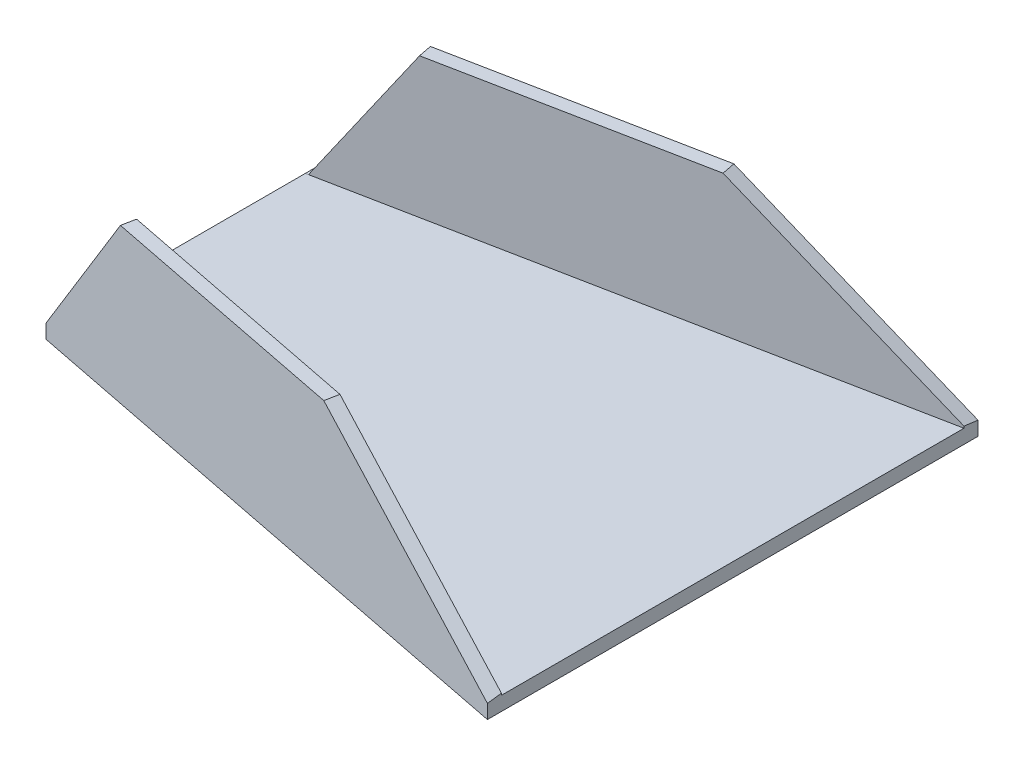
ISO-10303-21;
HEADER;
FILE_DESCRIPTION(('STEP AP214'),'2;1');
FILE_NAME('part.step','',(''),(''),'','','');
FILE_SCHEMA(('AUTOMOTIVE_DESIGN { 1 0 10303 214 1 1 1 1 }'));
ENDSEC;
DATA;
#1=APPLICATION_CONTEXT('core data for automotive mechanical design processes');
#2=APPLICATION_PROTOCOL_DEFINITION('international standard','automotive_design',2000,#1);
#3=PRODUCT_CONTEXT('',#1,'mechanical');
#4=PRODUCT('Part','Part','',(#3));
#5=PRODUCT_RELATED_PRODUCT_CATEGORY('part','',(#4));
#6=PRODUCT_DEFINITION_FORMATION('','',#4);
#7=PRODUCT_DEFINITION_CONTEXT('part definition',#1,'design');
#8=PRODUCT_DEFINITION('design','',#6,#7);
#9=PRODUCT_DEFINITION_SHAPE('','',#8);
#10=(LENGTH_UNIT() NAMED_UNIT(*) SI_UNIT(.MILLI.,.METRE.));
#11=(NAMED_UNIT(*) PLANE_ANGLE_UNIT() SI_UNIT($,.RADIAN.));
#12=(NAMED_UNIT(*) SI_UNIT($,.STERADIAN.) SOLID_ANGLE_UNIT());
#13=UNCERTAINTY_MEASURE_WITH_UNIT(LENGTH_MEASURE(1.E-05),#10,'distance_accuracy_value','');
#14=(GEOMETRIC_REPRESENTATION_CONTEXT(3) GLOBAL_UNCERTAINTY_ASSIGNED_CONTEXT((#13)) GLOBAL_UNIT_ASSIGNED_CONTEXT((#10,
#11,#12)) REPRESENTATION_CONTEXT('',''));
#15=CARTESIAN_POINT('',(0.,0.,0.));
#16=DIRECTION('',(0.,0.,1.));
#17=DIRECTION('',(1.,0.,0.));
#18=AXIS2_PLACEMENT_3D('',#15,#16,#17);
#19=CARTESIAN_POINT('',(0.,2.,0.));
#20=DIRECTION('',(0.,1.,0.));
#21=DIRECTION('',(0.,0.,1.));
#22=AXIS2_PLACEMENT_3D('',#19,#20,#21);
#23=PLANE('',#22);
#24=DIRECTION('',(-0.19375,0.,0.98105093522202));
#25=VECTOR('',#24,1.);
#26=CARTESIAN_POINT('',(0.968750000000003,1.99999999999999,34.0947453238899));
#27=LINE('',#26,#25);
#28=CARTESIAN_POINT('',(0.38015723739853,1.99999999999999,37.075078125));
#29=VERTEX_POINT('',#28);
#30=CARTESIAN_POINT('',(0.,1.99999999999999,39.));
#31=VERTEX_POINT('',#30);
#32=EDGE_CURVE('E217',#29,#31,#27,.T.);
#33=ORIENTED_EDGE('',*,*,#32,.F.);
#34=DIRECTION('',(-0.98105093522202,0.,-0.19375));
#35=VECTOR('',#34,1.);
#36=CARTESIAN_POINT('',(78.4840748177616,2.,52.5));
#37=LINE('',#36,#35);
#38=CARTESIAN_POINT('',(78.4840748177616,2.,52.5));
#39=VERTEX_POINT('',#38);
#40=EDGE_CURVE('E156',#39,#29,#37,.T.);
#41=ORIENTED_EDGE('',*,*,#40,.F.);
#42=DIRECTION('',(0.,0.,-1.));
#43=VECTOR('',#42,1.);
#44=CARTESIAN_POINT('',(78.4840748177616,2.,54.5));
#45=LINE('',#44,#43);
#46=CARTESIAN_POINT('',(78.4840748177616,2.,-13.5));
#47=VERTEX_POINT('',#46);
#48=EDGE_CURVE('E141',#39,#47,#45,.T.);
#49=ORIENTED_EDGE('',*,*,#48,.T.);
#50=DIRECTION('',(0.98105093522202,0.,-0.19375));
#51=VECTOR('',#50,1.);
#52=CARTESIAN_POINT('',(78.4840748177616,2.,-13.5));
#53=LINE('',#52,#51);
#54=CARTESIAN_POINT('',(0.,2.,1.99999999999999));
#55=VERTEX_POINT('',#54);
#56=EDGE_CURVE('E208',#55,#47,#53,.T.);
#57=ORIENTED_EDGE('',*,*,#56,.F.);
#58=DIRECTION('',(0.,0.,1.));
#59=VECTOR('',#58,1.);
#60=CARTESIAN_POINT('',(0.,2.,0.));
#61=LINE('',#60,#59);
#62=EDGE_CURVE('E146',#55,#31,#61,.T.);
#63=ORIENTED_EDGE('',*,*,#62,.T.);
#64=EDGE_LOOP('',(#33,#41,#49,#57,#63));
#65=FACE_BOUND('',#64,.T.);
#66=ADVANCED_FACE('F33',(#65),#23,.T.);
#67=CARTESIAN_POINT('',(78.4840748177616,2.,-15.5));
#68=DIRECTION('',(0.19375,0.,0.98105093522202));
#69=DIRECTION('',(0.98105093522202,0.,-0.19375));
#70=AXIS2_PLACEMENT_3D('',#67,#68,#69);
#71=PLANE('',#70);
#72=DIRECTION('',(-0.98105093522202,0.,0.19375));
#73=VECTOR('',#72,1.);
#74=CARTESIAN_POINT('',(0.,22.,0.));
#75=LINE('',#74,#73);
#76=CARTESIAN_POINT('',(49.3947183240999,22.,-9.75507624701314));
#77=VERTEX_POINT('',#76);
#78=CARTESIAN_POINT('',(13.2343623993372,22.,-2.61368459354385));
#79=VERTEX_POINT('',#78);
#80=EDGE_CURVE('E134',#77,#79,#75,.T.);
#81=ORIENTED_EDGE('',*,*,#80,.F.);
#82=DIRECTION('',(-0.813328085889316,0.559192903470748,0.160626029682539));
#83=VECTOR('',#82,1.);
#84=CARTESIAN_POINT('',(78.4840748177616,1.99999999999999,-15.5));
#85=LINE('',#84,#83);
#86=CARTESIAN_POINT('',(78.4840748177616,1.99999999999999,-15.5));
#87=VERTEX_POINT('',#86);
#88=EDGE_CURVE('E48',#87,#77,#85,.T.);
#89=ORIENTED_EDGE('',*,*,#88,.F.);
#90=DIRECTION('',(0.,-1.,0.));
#91=VECTOR('',#90,1.);
#92=CARTESIAN_POINT('',(78.4840748177616,2.,-15.5));
#93=LINE('',#92,#91);
#94=CARTESIAN_POINT('',(78.4840748177616,0.,-15.5));
#95=VERTEX_POINT('',#94);
#96=EDGE_CURVE('E131',#87,#95,#93,.T.);
#97=ORIENTED_EDGE('',*,*,#96,.T.);
#98=DIRECTION('',(-0.98105093522202,0.,0.19375));
#99=VECTOR('',#98,1.);
#100=CARTESIAN_POINT('',(78.4840748177616,0.,-15.5));
#101=LINE('',#100,#99);
#102=CARTESIAN_POINT('',(0.,0.,0.));
#103=VERTEX_POINT('',#102);
#104=EDGE_CURVE('E163',#95,#103,#101,.T.);
#105=ORIENTED_EDGE('',*,*,#104,.T.);
#106=DIRECTION('',(0.,-1.,0.));
#107=VECTOR('',#106,1.);
#108=CARTESIAN_POINT('',(0.,2.,0.));
#109=LINE('',#108,#107);
#110=CARTESIAN_POINT('',(0.,2.00027477475535,0.));
#111=VERTEX_POINT('',#110);
#112=EDGE_CURVE('E152',#111,#103,#109,.T.);
#113=ORIENTED_EDGE('',*,*,#112,.F.);
#114=DIRECTION('',(-0.548596720919497,-0.829037572555039,0.108343625047458));
#115=VECTOR('',#114,1.);
#116=CARTESIAN_POINT('',(0.,2.00027477475535,0.));
#117=LINE('',#116,#115);
#118=EDGE_CURVE('E229',#79,#111,#117,.T.);
#119=ORIENTED_EDGE('',*,*,#118,.F.);
#120=EDGE_LOOP('',(#81,#89,#97,#105,#113,#119));
#121=FACE_BOUND('',#120,.T.);
#122=ADVANCED_FACE('F35',(#121),#71,.F.);
#123=CARTESIAN_POINT('',(0.,2.,0.));
#124=DIRECTION('',(1.,0.,0.));
#125=DIRECTION('',(0.,0.,-1.));
#126=AXIS2_PLACEMENT_3D('',#123,#124,#125);
#127=PLANE('',#126);
#128=DIRECTION('',(0.,-1.,0.));
#129=VECTOR('',#128,1.);
#130=CARTESIAN_POINT('',(0.,22.,1.99999999999999));
#131=LINE('',#130,#129);
#132=CARTESIAN_POINT('',(0.,2.00027477475535,1.99999999999999));
#133=VERTEX_POINT('',#132);
#134=EDGE_CURVE('E203',#133,#55,#131,.T.);
#135=ORIENTED_EDGE('',*,*,#134,.F.);
#136=DIRECTION('',(0.,0.,-1.));
#137=VECTOR('',#136,1.);
#138=CARTESIAN_POINT('',(0.,2.00027477475535,0.));
#139=LINE('',#138,#137);
#140=EDGE_CURVE('E221',#133,#111,#139,.T.);
#141=ORIENTED_EDGE('',*,*,#140,.T.);
#142=ORIENTED_EDGE('',*,*,#112,.T.);
#143=DIRECTION('',(0.,0.,1.));
#144=VECTOR('',#143,1.);
#145=CARTESIAN_POINT('',(0.,0.,0.));
#146=LINE('',#145,#144);
#147=CARTESIAN_POINT('',(0.,0.,39.));
#148=VERTEX_POINT('',#147);
#149=EDGE_CURVE('E165',#103,#148,#146,.T.);
#150=ORIENTED_EDGE('',*,*,#149,.T.);
#151=DIRECTION('',(0.,-1.,0.));
#152=VECTOR('',#151,1.);
#153=CARTESIAN_POINT('',(0.,2.,39.));
#154=LINE('',#153,#152);
#155=EDGE_CURVE('E143',#31,#148,#154,.T.);
#156=ORIENTED_EDGE('',*,*,#155,.F.);
#157=ORIENTED_EDGE('',*,*,#62,.F.);
#158=EDGE_LOOP('',(#135,#141,#142,#150,#156,#157));
#159=FACE_BOUND('',#158,.T.);
#160=ADVANCED_FACE('F250',(#159),#127,.F.);
#161=CARTESIAN_POINT('',(0.,2.,39.));
#162=DIRECTION('',(0.19375,0.,-0.98105093522202));
#163=DIRECTION('',(-0.98105093522202,0.,-0.19375));
#164=AXIS2_PLACEMENT_3D('',#161,#162,#163);
#165=PLANE('',#164);
#166=DIRECTION('',(0.,-1.,0.));
#167=VECTOR('',#166,1.);
#168=CARTESIAN_POINT('',(78.4840748177616,2.,54.5));
#169=LINE('',#168,#167);
#170=CARTESIAN_POINT('',(78.4840748177616,2.,54.5));
#171=VERTEX_POINT('',#170);
#172=CARTESIAN_POINT('',(78.4840748177616,0.,54.5));
#173=VERTEX_POINT('',#172);
#174=EDGE_CURVE('E140',#171,#173,#169,.T.);
#175=ORIENTED_EDGE('',*,*,#174,.F.);
#176=DIRECTION('',(0.81332808588932,-0.559192903470742,0.16062602968254));
#177=VECTOR('',#176,1.);
#178=CARTESIAN_POINT('',(78.4840748177616,2.,54.5));
#179=LINE('',#178,#177);
#180=CARTESIAN_POINT('',(49.3947183240995,22.,48.7550762470131));
#181=VERTEX_POINT('',#180);
#182=EDGE_CURVE('E126',#181,#171,#179,.T.);
#183=ORIENTED_EDGE('',*,*,#182,.F.);
#184=DIRECTION('',(0.98105093522202,0.,0.19375));
#185=VECTOR('',#184,1.);
#186=CARTESIAN_POINT('',(0.,22.,39.));
#187=LINE('',#186,#185);
#188=CARTESIAN_POINT('',(13.2345442252695,22.,41.6137205027644));
#189=VERTEX_POINT('',#188);
#190=EDGE_CURVE('E194',#189,#181,#187,.T.);
#191=ORIENTED_EDGE('',*,*,#190,.F.);
#192=DIRECTION('',(0.548596720919491,0.829037572555043,0.108343625047457));
#193=VECTOR('',#192,1.);
#194=CARTESIAN_POINT('',(0.,1.99999999999999,39.));
#195=LINE('',#194,#193);
#196=EDGE_CURVE('E219',#31,#189,#195,.T.);
#197=ORIENTED_EDGE('',*,*,#196,.F.);
#198=ORIENTED_EDGE('',*,*,#155,.T.);
#199=DIRECTION('',(0.98105093522202,0.,0.19375));
#200=VECTOR('',#199,1.);
#201=CARTESIAN_POINT('',(0.,0.,39.));
#202=LINE('',#201,#200);
#203=EDGE_CURVE('E168',#148,#173,#202,.T.);
#204=ORIENTED_EDGE('',*,*,#203,.T.);
#205=EDGE_LOOP('',(#175,#183,#191,#197,#198,#204));
#206=FACE_BOUND('',#205,.T.);
#207=ADVANCED_FACE('F263',(#206),#165,.F.);
#208=CARTESIAN_POINT('',(78.4840748177616,2.,54.5));
#209=DIRECTION('',(-1.,0.,0.));
#210=DIRECTION('',(0.,0.,1.));
#211=AXIS2_PLACEMENT_3D('',#208,#209,#210);
#212=PLANE('',#211);
#213=ORIENTED_EDGE('',*,*,#96,.F.);
#214=DIRECTION('',(0.,0.129584136777352,0.991568430062025));
#215=VECTOR('',#214,1.);
#216=CARTESIAN_POINT('',(78.4840748177616,10.9944077345683,53.3245566046968));
#217=LINE('',#216,#215);
#218=CARTESIAN_POINT('',(78.4840748177616,2.26137205027642,-13.5));
#219=VERTEX_POINT('',#218);
#220=EDGE_CURVE('E119',#87,#219,#217,.T.);
#221=ORIENTED_EDGE('',*,*,#220,.T.);
#222=DIRECTION('',(0.,-1.,0.));
#223=VECTOR('',#222,1.);
#224=CARTESIAN_POINT('',(78.4840748177616,22.,-13.5));
#225=LINE('',#224,#223);
#226=EDGE_CURVE('E205',#219,#47,#225,.T.);
#227=ORIENTED_EDGE('',*,*,#226,.T.);
#228=ORIENTED_EDGE('',*,*,#48,.F.);
#229=DIRECTION('',(0.,-1.,0.));
#230=VECTOR('',#229,1.);
#231=CARTESIAN_POINT('',(78.4840748177616,22.,52.5));
#232=LINE('',#231,#230);
#233=CARTESIAN_POINT('',(78.4840748177616,2.26137205027645,52.5));
#234=VERTEX_POINT('',#233);
#235=EDGE_CURVE('E166',#234,#39,#232,.T.);
#236=ORIENTED_EDGE('',*,*,#235,.F.);
#237=DIRECTION('',(0.,-0.12958413677735,0.991568430062025));
#238=VECTOR('',#237,1.);
#239=CARTESIAN_POINT('',(78.4840748177616,2.00000000000001,54.5));
#240=LINE('',#239,#238);
#241=EDGE_CURVE('E232',#234,#171,#240,.T.);
#242=ORIENTED_EDGE('',*,*,#241,.T.);
#243=ORIENTED_EDGE('',*,*,#174,.T.);
#244=DIRECTION('',(0.,0.,-1.));
#245=VECTOR('',#244,1.);
#246=CARTESIAN_POINT('',(78.4840748177616,0.,54.5));
#247=LINE('',#246,#245);
#248=EDGE_CURVE('E138',#173,#95,#247,.T.);
#249=ORIENTED_EDGE('',*,*,#248,.T.);
#250=EDGE_LOOP('',(#213,#221,#227,#228,#236,#242,#243,#249));
#251=FACE_BOUND('',#250,.T.);
#252=ADVANCED_FACE('F136',(#251),#212,.F.);
#253=CARTESIAN_POINT('',(0.,0.,0.));
#254=DIRECTION('',(0.,1.,0.));
#255=DIRECTION('',(0.,0.,1.));
#256=AXIS2_PLACEMENT_3D('',#253,#254,#255);
#257=PLANE('',#256);
#258=ORIENTED_EDGE('',*,*,#104,.F.);
#259=ORIENTED_EDGE('',*,*,#248,.F.);
#260=ORIENTED_EDGE('',*,*,#203,.F.);
#261=ORIENTED_EDGE('',*,*,#149,.F.);
#262=EDGE_LOOP('',(#258,#259,#260,#261));
#263=FACE_BOUND('',#262,.T.);
#264=ADVANCED_FACE('F253',(#263),#257,.F.);
#265=CARTESIAN_POINT('',(78.4840748177616,22.,52.5));
#266=DIRECTION('',(-0.19375,0.,0.98105093522202));
#267=DIRECTION('',(0.98105093522202,0.,0.19375));
#268=AXIS2_PLACEMENT_3D('',#265,#266,#267);
#269=PLANE('',#268);
#270=DIRECTION('',(-0.98105093522202,0.,-0.19375));
#271=VECTOR('',#270,1.);
#272=CARTESIAN_POINT('',(78.4840748177616,22.,52.5));
#273=LINE('',#272,#271);
#274=CARTESIAN_POINT('',(49.774875561498,22.,46.8301543720131));
#275=VERTEX_POINT('',#274);
#276=CARTESIAN_POINT('',(13.6147014626681,22.,39.6887986277644));
#277=VERTEX_POINT('',#276);
#278=EDGE_CURVE('E189',#275,#277,#273,.T.);
#279=ORIENTED_EDGE('',*,*,#278,.F.);
#280=DIRECTION('',(0.81332808588932,-0.559192903470742,0.16062602968254));
#281=VECTOR('',#280,1.);
#282=CARTESIAN_POINT('',(69.5068028561737,8.43357593766309,50.7270579639537));
#283=LINE('',#282,#281);
#284=EDGE_CURVE('E55',#275,#234,#283,.T.);
#285=ORIENTED_EDGE('',*,*,#284,.T.);
#286=ORIENTED_EDGE('',*,*,#235,.T.);
#287=ORIENTED_EDGE('',*,*,#40,.T.);
#288=DIRECTION('',(0.548596720919491,0.829037572555043,0.108343625047457));
#289=VECTOR('',#288,1.);
#290=CARTESIAN_POINT('',(33.8991406554265,52.6537782450083,43.694819062073));
#291=LINE('',#290,#289);
#292=EDGE_CURVE('E211',#29,#277,#291,.T.);
#293=ORIENTED_EDGE('',*,*,#292,.T.);
#294=EDGE_LOOP('',(#279,#285,#286,#287,#293));
#295=FACE_BOUND('',#294,.T.);
#296=ADVANCED_FACE('F255',(#295),#269,.F.);
#297=CARTESIAN_POINT('',(0.,22.,0.));
#298=DIRECTION('',(0.,1.,0.));
#299=DIRECTION('',(0.,0.,1.));
#300=AXIS2_PLACEMENT_3D('',#297,#298,#299);
#301=PLANE('',#300);
#302=DIRECTION('',(-0.19375,0.,0.98105093522202));
#303=VECTOR('',#302,1.);
#304=CARTESIAN_POINT('',(56.8077844533709,22.,11.2190996845131));
#305=LINE('',#304,#303);
#306=EDGE_CURVE('E41',#275,#181,#305,.T.);
#307=ORIENTED_EDGE('',*,*,#306,.F.);
#308=ORIENTED_EDGE('',*,*,#278,.T.);
#309=DIRECTION('',(0.19375,0.,-0.98105093522202));
#310=VECTOR('',#309,1.);
#311=CARTESIAN_POINT('',(20.6476103545409,22.,4.0777439402644));
#312=LINE('',#311,#310);
#313=EDGE_CURVE('E153',#189,#277,#312,.T.);
#314=ORIENTED_EDGE('',*,*,#313,.F.);
#315=ORIENTED_EDGE('',*,*,#190,.T.);
#316=EDGE_LOOP('',(#307,#308,#314,#315));
#317=FACE_BOUND('',#316,.T.);
#318=ADVANCED_FACE('F261',(#317),#301,.T.);
#319=CARTESIAN_POINT('',(78.4840748177616,22.,-13.5));
#320=DIRECTION('',(-0.19375,0.,-0.98105093522202));
#321=DIRECTION('',(-0.98105093522202,0.,0.19375));
#322=AXIS2_PLACEMENT_3D('',#319,#320,#321);
#323=PLANE('',#322);
#324=ORIENTED_EDGE('',*,*,#226,.F.);
#325=DIRECTION('',(-0.813328085889316,0.559192903470748,0.160626029682539));
#326=VECTOR('',#325,1.);
#327=CARTESIAN_POINT('',(69.5068028561737,8.43357593766321,-11.7270579639537));
#328=LINE('',#327,#326);
#329=CARTESIAN_POINT('',(49.7748755614985,22.,-7.83015437201316));
#330=VERTEX_POINT('',#329);
#331=EDGE_CURVE('E122',#219,#330,#328,.T.);
#332=ORIENTED_EDGE('',*,*,#331,.T.);
#333=DIRECTION('',(0.98105093522202,0.,-0.19375));
#334=VECTOR('',#333,1.);
#335=CARTESIAN_POINT('',(78.4840748177616,22.,-13.5));
#336=LINE('',#335,#334);
#337=CARTESIAN_POINT('',(13.6145196367357,22.,-0.688762718543854));
#338=VERTEX_POINT('',#337);
#339=EDGE_CURVE('E207',#338,#330,#336,.T.);
#340=ORIENTED_EDGE('',*,*,#339,.F.);
#341=DIRECTION('',(-0.548596720919497,-0.829037572555039,0.108343625047458));
#342=VECTOR('',#341,1.);
#343=CARTESIAN_POINT('',(33.8990156858641,52.6538641661685,-4.69479438154739));
#344=LINE('',#343,#342);
#345=CARTESIAN_POINT('',(0.380157237398528,2.00027477475535,1.92492187499999));
#346=VERTEX_POINT('',#345);
#347=EDGE_CURVE('E224',#338,#346,#344,.T.);
#348=ORIENTED_EDGE('',*,*,#347,.T.);
#349=DIRECTION('',(-0.98105093522202,0.,0.19375));
#350=VECTOR('',#349,1.);
#351=CARTESIAN_POINT('',(78.4840748177616,2.00027477475534,-13.5));
#352=LINE('',#351,#350);
#353=EDGE_CURVE('E186',#346,#133,#352,.T.);
#354=ORIENTED_EDGE('',*,*,#353,.T.);
#355=ORIENTED_EDGE('',*,*,#134,.T.);
#356=ORIENTED_EDGE('',*,*,#56,.T.);
#357=EDGE_LOOP('',(#324,#332,#340,#348,#354,#355,#356));
#358=FACE_BOUND('',#357,.T.);
#359=ADVANCED_FACE('F239',(#358),#323,.F.);
#360=CARTESIAN_POINT('',(0.,22.,0.));
#361=DIRECTION('',(0.,-1.,0.));
#362=DIRECTION('',(0.,0.,-1.));
#363=AXIS2_PLACEMENT_3D('',#360,#361,#362);
#364=PLANE('',#363);
#365=ORIENTED_EDGE('',*,*,#339,.T.);
#366=DIRECTION('',(-0.19375,0.,-0.98105093522202));
#367=VECTOR('',#366,1.);
#368=CARTESIAN_POINT('',(49.3947183240999,22.,-9.75507624701314));
#369=LINE('',#368,#367);
#370=EDGE_CURVE('E11',#330,#77,#369,.T.);
#371=ORIENTED_EDGE('',*,*,#370,.T.);
#372=ORIENTED_EDGE('',*,*,#80,.T.);
#373=DIRECTION('',(0.19375,0.,0.98105093522202));
#374=VECTOR('',#373,1.);
#375=CARTESIAN_POINT('',(13.2343623993372,22.,-2.61368459354385));
#376=LINE('',#375,#374);
#377=EDGE_CURVE('E183',#79,#338,#376,.T.);
#378=ORIENTED_EDGE('',*,*,#377,.T.);
#379=EDGE_LOOP('',(#365,#371,#372,#378));
#380=FACE_BOUND('',#379,.T.);
#381=ADVANCED_FACE('F241',(#380),#364,.F.);
#382=CARTESIAN_POINT('',(0.968750000000003,1.99999999999999,34.0947453238899));
#383=DIRECTION('',(0.813328085889318,-0.559192903470745,0.16062602968254));
#384=DIRECTION('',(0.566549355024539,0.824027807978152,0.));
#385=AXIS2_PLACEMENT_3D('',#382,#383,#384);
#386=PLANE('',#385);
#387=ORIENTED_EDGE('',*,*,#32,.T.);
#388=ORIENTED_EDGE('',*,*,#196,.T.);
#389=ORIENTED_EDGE('',*,*,#313,.T.);
#390=ORIENTED_EDGE('',*,*,#292,.F.);
#391=EDGE_LOOP('',(#387,#388,#389,#390));
#392=FACE_BOUND('',#391,.T.);
#393=ADVANCED_FACE('F277',(#392),#386,.F.);
#394=CARTESIAN_POINT('',(-6.85203624606926,2.00027477475535,6.44979969489957));
#395=DIRECTION('',(0.,-1.,0.));
#396=DIRECTION('',(1.,0.,0.));
#397=AXIS2_PLACEMENT_3D('',#394,#395,#396);
#398=PLANE('',#397);
#399=ORIENTED_EDGE('',*,*,#353,.F.);
#400=DIRECTION('',(-0.19375,0.,-0.98105093522202));
#401=VECTOR('',#400,1.);
#402=CARTESIAN_POINT('',(0.968750000000001,2.00027477475535,4.9052546761101));
#403=LINE('',#402,#401);
#404=EDGE_CURVE('E227',#346,#111,#403,.T.);
#405=ORIENTED_EDGE('',*,*,#404,.T.);
#406=ORIENTED_EDGE('',*,*,#140,.F.);
#407=EDGE_LOOP('',(#399,#405,#406));
#408=FACE_BOUND('',#407,.T.);
#409=ADVANCED_FACE('F280',(#408),#398,.F.);
#410=CARTESIAN_POINT('',(0.968750000000001,2.00027477475535,4.9052546761101));
#411=DIRECTION('',(0.813328085889314,-0.559192903470751,-0.160626029682539));
#412=DIRECTION('',(0.566549355024546,0.824027807978148,0.));
#413=AXIS2_PLACEMENT_3D('',#410,#411,#412);
#414=PLANE('',#413);
#415=ORIENTED_EDGE('',*,*,#377,.F.);
#416=ORIENTED_EDGE('',*,*,#118,.T.);
#417=ORIENTED_EDGE('',*,*,#404,.F.);
#418=ORIENTED_EDGE('',*,*,#347,.F.);
#419=EDGE_LOOP('',(#415,#416,#417,#418));
#420=FACE_BOUND('',#419,.T.);
#421=ADVANCED_FACE('F244',(#420),#414,.F.);
#422=CARTESIAN_POINT('',(79.4528248177616,2.,49.5947453238899));
#423=DIRECTION('',(-0.548596720919488,-0.829037572555045,-0.108343625047456));
#424=DIRECTION('',(0.833946595823521,-0.551845155196964,0.));
#425=AXIS2_PLACEMENT_3D('',#422,#423,#424);
#426=PLANE('',#425);
#427=ORIENTED_EDGE('',*,*,#284,.F.);
#428=ORIENTED_EDGE('',*,*,#306,.T.);
#429=ORIENTED_EDGE('',*,*,#182,.T.);
#430=ORIENTED_EDGE('',*,*,#241,.F.);
#431=EDGE_LOOP('',(#427,#428,#429,#430));
#432=FACE_BOUND('',#431,.T.);
#433=ADVANCED_FACE('F284',(#432),#426,.F.);
#434=CARTESIAN_POINT('',(79.4528248177616,1.99999999999999,-10.5947453238899));
#435=DIRECTION('',(-0.548596720919494,-0.829037572555041,0.108343625047457));
#436=DIRECTION('',(0.833946595823517,-0.55184515519697,0.));
#437=AXIS2_PLACEMENT_3D('',#434,#435,#436);
#438=PLANE('',#437);
#439=ORIENTED_EDGE('',*,*,#88,.T.);
#440=ORIENTED_EDGE('',*,*,#370,.F.);
#441=ORIENTED_EDGE('',*,*,#331,.F.);
#442=ORIENTED_EDGE('',*,*,#220,.F.);
#443=EDGE_LOOP('',(#439,#440,#441,#442));
#444=FACE_BOUND('',#443,.T.);
#445=ADVANCED_FACE('F120',(#444),#438,.F.);
#446=CLOSED_SHELL('',(#66,#122,#160,#207,#252,#264,#296,#318,#359,#381,#393,#409,#421,#433,#445));
#447=MANIFOLD_SOLID_BREP('B2',#446);
#448=ADVANCED_BREP_SHAPE_REPRESENTATION('',(#18,#447),#14);
#449=SHAPE_DEFINITION_REPRESENTATION(#9,#448);
ENDSEC;
END-ISO-10303-21;
